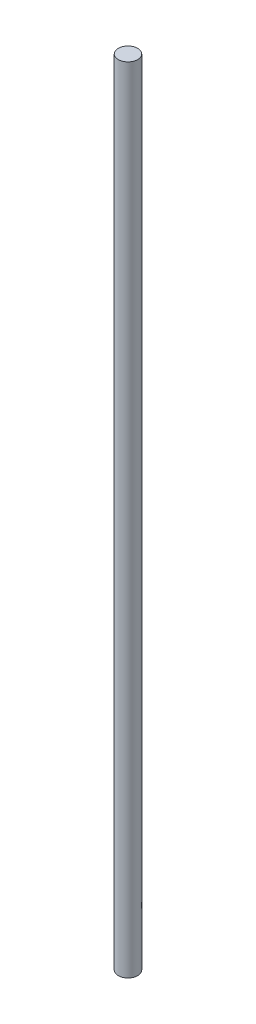
ISO-10303-21;
HEADER;
FILE_DESCRIPTION(('STEP AP214'),'2;1');
FILE_NAME('part.step','',(''),(''),'','','');
FILE_SCHEMA(('AUTOMOTIVE_DESIGN { 1 0 10303 214 1 1 1 1 }'));
ENDSEC;
DATA;
#1=APPLICATION_CONTEXT('core data for automotive mechanical design processes');
#2=APPLICATION_PROTOCOL_DEFINITION('international standard','automotive_design',2000,#1);
#3=PRODUCT_CONTEXT('',#1,'mechanical');
#4=PRODUCT('Part','Part','',(#3));
#5=PRODUCT_RELATED_PRODUCT_CATEGORY('part','',(#4));
#6=PRODUCT_DEFINITION_FORMATION('','',#4);
#7=PRODUCT_DEFINITION_CONTEXT('part definition',#1,'design');
#8=PRODUCT_DEFINITION('design','',#6,#7);
#9=PRODUCT_DEFINITION_SHAPE('','',#8);
#10=(LENGTH_UNIT() NAMED_UNIT(*) SI_UNIT(.MILLI.,.METRE.));
#11=(NAMED_UNIT(*) PLANE_ANGLE_UNIT() SI_UNIT($,.RADIAN.));
#12=(NAMED_UNIT(*) SI_UNIT($,.STERADIAN.) SOLID_ANGLE_UNIT());
#13=UNCERTAINTY_MEASURE_WITH_UNIT(LENGTH_MEASURE(1.E-05),#10,'distance_accuracy_value','');
#14=(GEOMETRIC_REPRESENTATION_CONTEXT(3) GLOBAL_UNCERTAINTY_ASSIGNED_CONTEXT((#13)) GLOBAL_UNIT_ASSIGNED_CONTEXT((#10,
#11,#12)) REPRESENTATION_CONTEXT('',''));
#15=CARTESIAN_POINT('',(0.,0.,0.));
#16=DIRECTION('',(0.,0.,1.));
#17=DIRECTION('',(1.,0.,0.));
#18=AXIS2_PLACEMENT_3D('',#15,#16,#17);
#19=CARTESIAN_POINT('',(0.,337.313708498985,0.));
#20=DIRECTION('',(0.,-1.,0.));
#21=DIRECTION('',(0.,0.,-1.));
#22=AXIS2_PLACEMENT_3D('',#19,#20,#21);
#23=CYLINDRICAL_SURFACE('',#22,4.);
#24=CARTESIAN_POINT('',(0.,0.,0.));
#25=DIRECTION('',(0.,1.,0.));
#26=DIRECTION('',(0.,0.,1.));
#27=AXIS2_PLACEMENT_3D('',#24,#25,#26);
#28=CIRCLE('',#27,4.);
#29=CARTESIAN_POINT('',(0.,0.,4.));
#30=VERTEX_POINT('',#29);
#31=EDGE_CURVE('E46',#30,#30,#28,.T.);
#32=ORIENTED_EDGE('',*,*,#31,.T.);
#33=EDGE_LOOP('',(#32));
#34=FACE_BOUND('',#33,.T.);
#35=CARTESIAN_POINT('',(0.,326.000000000001,0.));
#36=DIRECTION('',(0.,1.,0.));
#37=DIRECTION('',(0.,0.,1.));
#38=AXIS2_PLACEMENT_3D('',#35,#36,#37);
#39=CIRCLE('',#38,4.);
#40=CARTESIAN_POINT('',(0.,326.000000000001,4.));
#41=VERTEX_POINT('',#40);
#42=EDGE_CURVE('E10',#41,#41,#39,.T.);
#43=ORIENTED_EDGE('',*,*,#42,.F.);
#44=EDGE_LOOP('',(#43));
#45=FACE_BOUND('',#44,.T.);
#46=ADVANCED_FACE('F39',(#34,#45),#23,.T.);
#47=CARTESIAN_POINT('',(0.,0.,0.));
#48=DIRECTION('',(0.,1.,0.));
#49=DIRECTION('',(0.,0.,1.));
#50=AXIS2_PLACEMENT_3D('',#47,#48,#49);
#51=PLANE('',#50);
#52=ORIENTED_EDGE('',*,*,#31,.F.);
#53=EDGE_LOOP('',(#52));
#54=FACE_BOUND('',#53,.T.);
#55=ADVANCED_FACE('F54',(#54),#51,.F.);
#56=CARTESIAN_POINT('',(-238.301992342229,326.000000000001,3.94517042197488));
#57=DIRECTION('',(0.,1.,0.));
#58=DIRECTION('',(-0.99999197219271,0.,-0.00400693775032354));
#59=AXIS2_PLACEMENT_3D('',#56,#57,#58);
#60=PLANE('',#59);
#61=ORIENTED_EDGE('',*,*,#42,.T.);
#62=EDGE_LOOP('',(#61));
#63=FACE_BOUND('',#62,.T.);
#64=ADVANCED_FACE('F41',(#63),#60,.T.);
#65=CLOSED_SHELL('',(#46,#55,#64));
#66=MANIFOLD_SOLID_BREP('B2',#65);
#67=ADVANCED_BREP_SHAPE_REPRESENTATION('',(#18,#66),#14);
#68=SHAPE_DEFINITION_REPRESENTATION(#9,#67);
ENDSEC;
END-ISO-10303-21;
